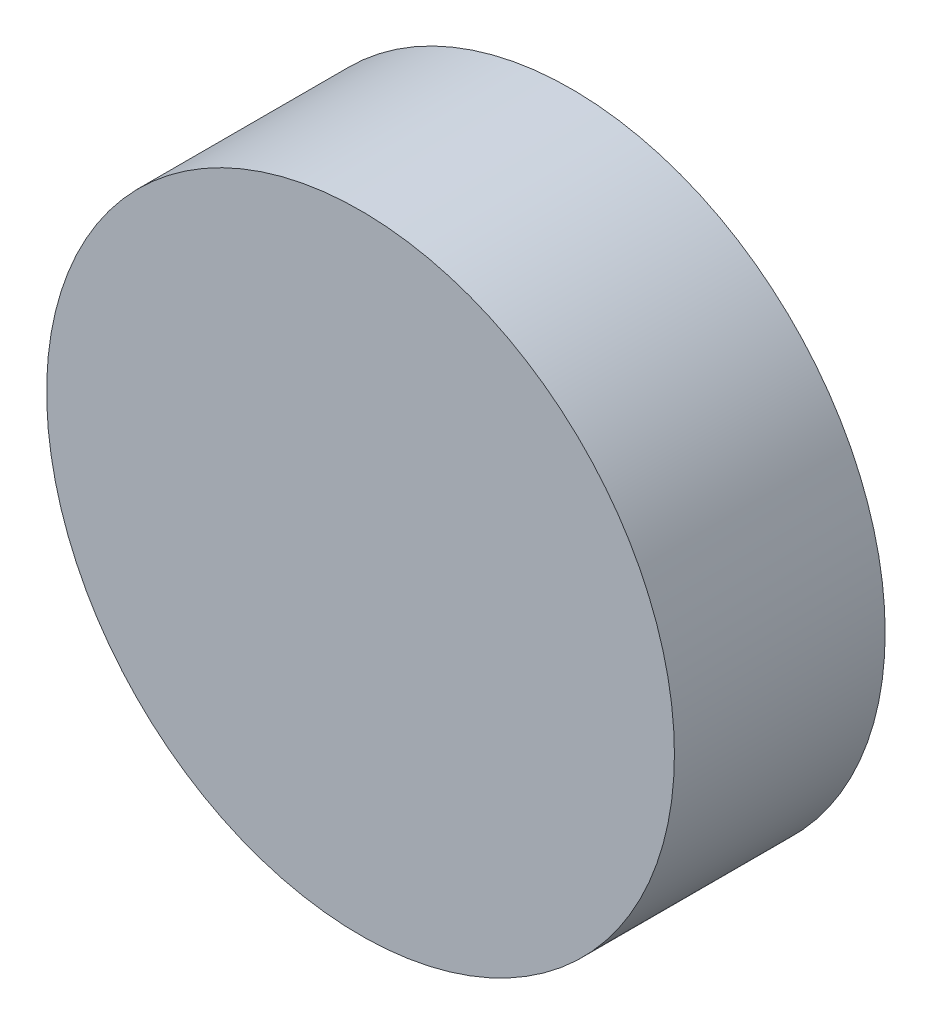
ISO-10303-21;
HEADER;
FILE_DESCRIPTION(('STEP AP214'),'2;1');
FILE_NAME('part.step','',(''),(''),'','','');
FILE_SCHEMA(('AUTOMOTIVE_DESIGN { 1 0 10303 214 1 1 1 1 }'));
ENDSEC;
DATA;
#1=APPLICATION_CONTEXT('core data for automotive mechanical design processes');
#2=APPLICATION_PROTOCOL_DEFINITION('international standard','automotive_design',2000,#1);
#3=PRODUCT_CONTEXT('',#1,'mechanical');
#4=PRODUCT('Part','Part','',(#3));
#5=PRODUCT_RELATED_PRODUCT_CATEGORY('part','',(#4));
#6=PRODUCT_DEFINITION_FORMATION('','',#4);
#7=PRODUCT_DEFINITION_CONTEXT('part definition',#1,'design');
#8=PRODUCT_DEFINITION('design','',#6,#7);
#9=PRODUCT_DEFINITION_SHAPE('','',#8);
#10=(LENGTH_UNIT() NAMED_UNIT(*) SI_UNIT(.MILLI.,.METRE.));
#11=(NAMED_UNIT(*) PLANE_ANGLE_UNIT() SI_UNIT($,.RADIAN.));
#12=(NAMED_UNIT(*) SI_UNIT($,.STERADIAN.) SOLID_ANGLE_UNIT());
#13=UNCERTAINTY_MEASURE_WITH_UNIT(LENGTH_MEASURE(1.E-05),#10,'distance_accuracy_value','');
#14=(GEOMETRIC_REPRESENTATION_CONTEXT(3) GLOBAL_UNCERTAINTY_ASSIGNED_CONTEXT((#13)) GLOBAL_UNIT_ASSIGNED_CONTEXT((#10,
#11,#12)) REPRESENTATION_CONTEXT('',''));
#15=CARTESIAN_POINT('',(0.,0.,0.));
#16=DIRECTION('',(0.,0.,1.));
#17=DIRECTION('',(1.,0.,0.));
#18=AXIS2_PLACEMENT_3D('',#15,#16,#17);
#19=CARTESIAN_POINT('',(0.,0.,9.4));
#20=DIRECTION('',(0.,0.,-1.));
#21=DIRECTION('',(-1.,0.,0.));
#22=AXIS2_PLACEMENT_3D('',#19,#20,#21);
#23=CYLINDRICAL_SURFACE('',#22,14.);
#24=CARTESIAN_POINT('',(0.,0.,9.4));
#25=DIRECTION('',(0.,0.,1.));
#26=DIRECTION('',(1.,0.,0.));
#27=AXIS2_PLACEMENT_3D('',#24,#25,#26);
#28=CIRCLE('',#27,14.);
#29=CARTESIAN_POINT('',(14.,0.,9.4));
#30=VERTEX_POINT('',#29);
#31=EDGE_CURVE('E10',#30,#30,#28,.T.);
#32=ORIENTED_EDGE('',*,*,#31,.F.);
#33=EDGE_LOOP('',(#32));
#34=FACE_BOUND('',#33,.T.);
#35=CARTESIAN_POINT('',(0.,0.,0.));
#36=DIRECTION('',(0.,0.,1.));
#37=DIRECTION('',(1.,0.,0.));
#38=AXIS2_PLACEMENT_3D('',#35,#36,#37);
#39=CIRCLE('',#38,14.);
#40=CARTESIAN_POINT('',(14.,0.,0.));
#41=VERTEX_POINT('',#40);
#42=EDGE_CURVE('E40',#41,#41,#39,.T.);
#43=ORIENTED_EDGE('',*,*,#42,.T.);
#44=EDGE_LOOP('',(#43));
#45=FACE_BOUND('',#44,.T.);
#46=ADVANCED_FACE('F37',(#34,#45),#23,.T.);
#47=CARTESIAN_POINT('',(0.,0.,9.4));
#48=DIRECTION('',(0.,0.,1.));
#49=DIRECTION('',(1.,0.,0.));
#50=AXIS2_PLACEMENT_3D('',#47,#48,#49);
#51=PLANE('',#50);
#52=ORIENTED_EDGE('',*,*,#31,.T.);
#53=EDGE_LOOP('',(#52));
#54=FACE_BOUND('',#53,.T.);
#55=ADVANCED_FACE('F54',(#54),#51,.T.);
#56=CARTESIAN_POINT('',(0.,0.,0.));
#57=DIRECTION('',(0.,0.,1.));
#58=DIRECTION('',(1.,0.,0.));
#59=AXIS2_PLACEMENT_3D('',#56,#57,#58);
#60=PLANE('',#59);
#61=ORIENTED_EDGE('',*,*,#42,.F.);
#62=EDGE_LOOP('',(#61));
#63=FACE_BOUND('',#62,.T.);
#64=ADVANCED_FACE('F52',(#63),#60,.F.);
#65=CLOSED_SHELL('',(#46,#55,#64));
#66=MANIFOLD_SOLID_BREP('B2',#65);
#67=ADVANCED_BREP_SHAPE_REPRESENTATION('',(#18,#66),#14);
#68=SHAPE_DEFINITION_REPRESENTATION(#9,#67);
ENDSEC;
END-ISO-10303-21;
